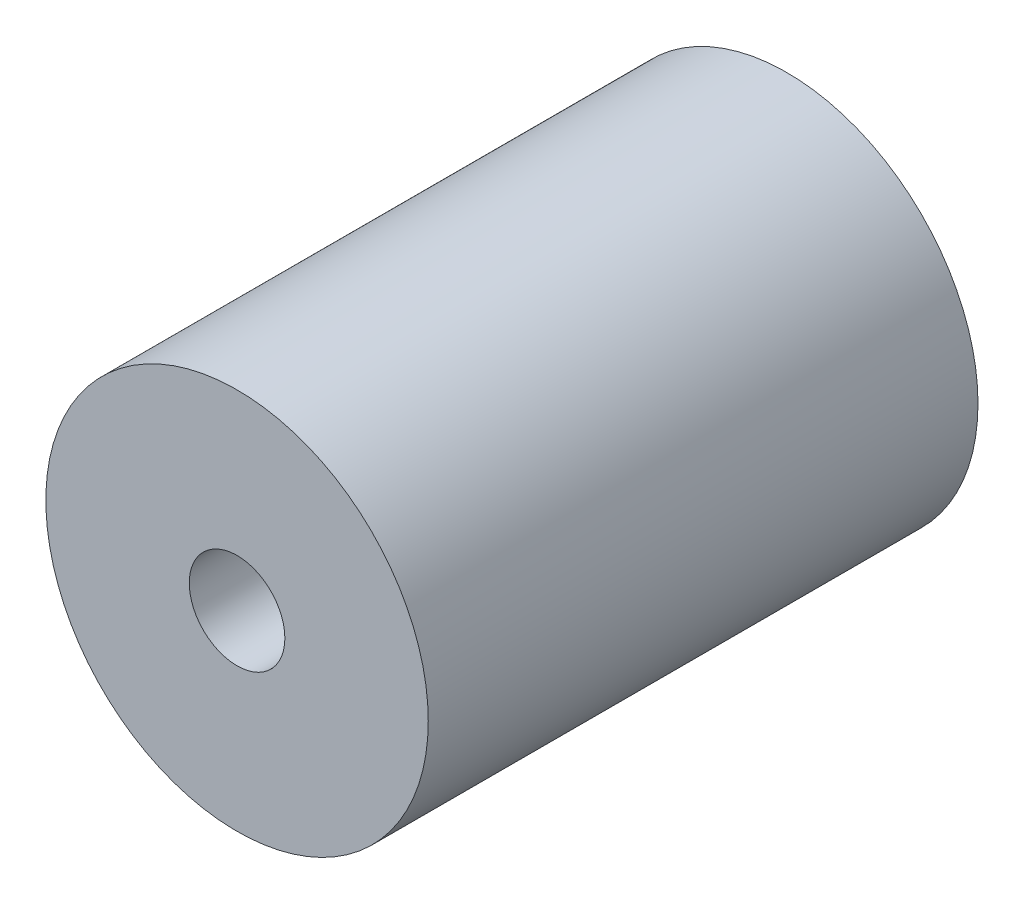
ISO-10303-21;
HEADER;
FILE_DESCRIPTION(('STEP AP214'),'2;1');
FILE_NAME('part.step','',(''),(''),'','','');
FILE_SCHEMA(('AUTOMOTIVE_DESIGN { 1 0 10303 214 1 1 1 1 }'));
ENDSEC;
DATA;
#1=APPLICATION_CONTEXT('core data for automotive mechanical design processes');
#2=APPLICATION_PROTOCOL_DEFINITION('international standard','automotive_design',2000,#1);
#3=PRODUCT_CONTEXT('',#1,'mechanical');
#4=PRODUCT('Part','Part','',(#3));
#5=PRODUCT_RELATED_PRODUCT_CATEGORY('part','',(#4));
#6=PRODUCT_DEFINITION_FORMATION('','',#4);
#7=PRODUCT_DEFINITION_CONTEXT('part definition',#1,'design');
#8=PRODUCT_DEFINITION('design','',#6,#7);
#9=PRODUCT_DEFINITION_SHAPE('','',#8);
#10=(LENGTH_UNIT() NAMED_UNIT(*) SI_UNIT(.MILLI.,.METRE.));
#11=(NAMED_UNIT(*) PLANE_ANGLE_UNIT() SI_UNIT($,.RADIAN.));
#12=(NAMED_UNIT(*) SI_UNIT($,.STERADIAN.) SOLID_ANGLE_UNIT());
#13=UNCERTAINTY_MEASURE_WITH_UNIT(LENGTH_MEASURE(1.E-05),#10,'distance_accuracy_value','');
#14=(GEOMETRIC_REPRESENTATION_CONTEXT(3) GLOBAL_UNCERTAINTY_ASSIGNED_CONTEXT((#13)) GLOBAL_UNIT_ASSIGNED_CONTEXT((#10,
#11,#12)) REPRESENTATION_CONTEXT('',''));
#15=CARTESIAN_POINT('',(0.,0.,0.));
#16=DIRECTION('',(0.,0.,1.));
#17=DIRECTION('',(1.,0.,0.));
#18=AXIS2_PLACEMENT_3D('',#15,#16,#17);
#19=CARTESIAN_POINT('',(0.,0.,23.));
#20=DIRECTION('',(0.,0.,1.));
#21=DIRECTION('',(1.,0.,0.));
#22=AXIS2_PLACEMENT_3D('',#19,#20,#21);
#23=PLANE('',#22);
#24=CARTESIAN_POINT('',(0.,0.,23.));
#25=DIRECTION('',(0.,0.,1.));
#26=DIRECTION('',(1.,0.,0.));
#27=AXIS2_PLACEMENT_3D('',#24,#25,#26);
#28=CIRCLE('',#27,8.);
#29=CARTESIAN_POINT('',(8.,0.,23.));
#30=VERTEX_POINT('',#29);
#31=EDGE_CURVE('E10',#30,#30,#28,.T.);
#32=ORIENTED_EDGE('',*,*,#31,.T.);
#33=EDGE_LOOP('',(#32));
#34=FACE_BOUND('',#33,.T.);
#35=CARTESIAN_POINT('',(0.,0.,23.));
#36=DIRECTION('',(0.,0.,1.));
#37=DIRECTION('',(1.,0.,0.));
#38=AXIS2_PLACEMENT_3D('',#35,#36,#37);
#39=CIRCLE('',#38,2.);
#40=CARTESIAN_POINT('',(2.,0.,23.));
#41=VERTEX_POINT('',#40);
#42=EDGE_CURVE('E41',#41,#41,#39,.T.);
#43=ORIENTED_EDGE('',*,*,#42,.F.);
#44=EDGE_LOOP('',(#43));
#45=FACE_BOUND('',#44,.T.);
#46=ADVANCED_FACE('F30',(#34,#45),#23,.T.);
#47=CARTESIAN_POINT('',(0.,0.,0.));
#48=DIRECTION('',(0.,0.,1.));
#49=DIRECTION('',(1.,0.,0.));
#50=AXIS2_PLACEMENT_3D('',#47,#48,#49);
#51=PLANE('',#50);
#52=CARTESIAN_POINT('',(0.,0.,0.));
#53=DIRECTION('',(0.,0.,1.));
#54=DIRECTION('',(1.,0.,0.));
#55=AXIS2_PLACEMENT_3D('',#52,#53,#54);
#56=CIRCLE('',#55,8.);
#57=CARTESIAN_POINT('',(8.,0.,0.));
#58=VERTEX_POINT('',#57);
#59=EDGE_CURVE('E34',#58,#58,#56,.T.);
#60=ORIENTED_EDGE('',*,*,#59,.F.);
#61=EDGE_LOOP('',(#60));
#62=FACE_BOUND('',#61,.T.);
#63=CARTESIAN_POINT('',(0.,0.,0.));
#64=DIRECTION('',(0.,0.,1.));
#65=DIRECTION('',(1.,0.,0.));
#66=AXIS2_PLACEMENT_3D('',#63,#64,#65);
#67=CIRCLE('',#66,2.);
#68=CARTESIAN_POINT('',(2.,0.,0.));
#69=VERTEX_POINT('',#68);
#70=EDGE_CURVE('E43',#69,#69,#67,.T.);
#71=ORIENTED_EDGE('',*,*,#70,.T.);
#72=EDGE_LOOP('',(#71));
#73=FACE_BOUND('',#72,.T.);
#74=ADVANCED_FACE('F53',(#62,#73),#51,.F.);
#75=CARTESIAN_POINT('',(0.,0.,23.));
#76=DIRECTION('',(0.,0.,-1.));
#77=DIRECTION('',(-1.,0.,0.));
#78=AXIS2_PLACEMENT_3D('',#75,#76,#77);
#79=CYLINDRICAL_SURFACE('',#78,8.);
#80=ORIENTED_EDGE('',*,*,#31,.F.);
#81=EDGE_LOOP('',(#80));
#82=FACE_BOUND('',#81,.T.);
#83=ORIENTED_EDGE('',*,*,#59,.T.);
#84=EDGE_LOOP('',(#83));
#85=FACE_BOUND('',#84,.T.);
#86=ADVANCED_FACE('F32',(#82,#85),#79,.T.);
#87=CARTESIAN_POINT('',(0.,0.,23.));
#88=DIRECTION('',(0.,0.,-1.));
#89=DIRECTION('',(-1.,0.,0.));
#90=AXIS2_PLACEMENT_3D('',#87,#88,#89);
#91=CYLINDRICAL_SURFACE('',#90,2.);
#92=ORIENTED_EDGE('',*,*,#42,.T.);
#93=EDGE_LOOP('',(#92));
#94=FACE_BOUND('',#93,.T.);
#95=ORIENTED_EDGE('',*,*,#70,.F.);
#96=EDGE_LOOP('',(#95));
#97=FACE_BOUND('',#96,.T.);
#98=ADVANCED_FACE('F49',(#94,#97),#91,.F.);
#99=CLOSED_SHELL('',(#46,#74,#86,#98));
#100=MANIFOLD_SOLID_BREP('B2',#99);
#101=ADVANCED_BREP_SHAPE_REPRESENTATION('',(#18,#100),#14);
#102=SHAPE_DEFINITION_REPRESENTATION(#9,#101);
ENDSEC;
END-ISO-10303-21;
